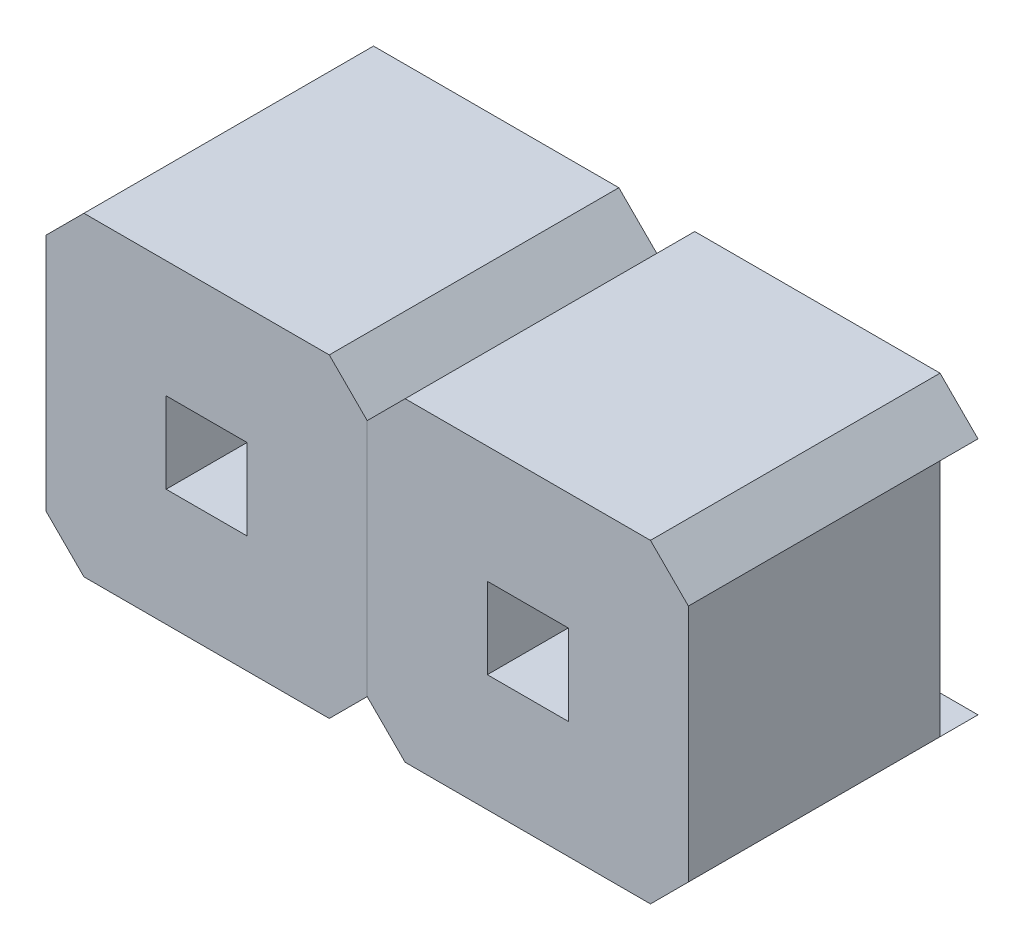
ISO-10303-21;
HEADER;
FILE_DESCRIPTION(('STEP AP214'),'2;1');
FILE_NAME('part.step','',(''),(''),'','','');
FILE_SCHEMA(('AUTOMOTIVE_DESIGN { 1 0 10303 214 1 1 1 1 }'));
ENDSEC;
DATA;
#1=APPLICATION_CONTEXT('core data for automotive mechanical design processes');
#2=APPLICATION_PROTOCOL_DEFINITION('international standard','automotive_design',2000,#1);
#3=PRODUCT_CONTEXT('',#1,'mechanical');
#4=PRODUCT('Part','Part','',(#3));
#5=PRODUCT_RELATED_PRODUCT_CATEGORY('part','',(#4));
#6=PRODUCT_DEFINITION_FORMATION('','',#4);
#7=PRODUCT_DEFINITION_CONTEXT('part definition',#1,'design');
#8=PRODUCT_DEFINITION('design','',#6,#7);
#9=PRODUCT_DEFINITION_SHAPE('','',#8);
#10=(LENGTH_UNIT() NAMED_UNIT(*) SI_UNIT(.MILLI.,.METRE.));
#11=(NAMED_UNIT(*) PLANE_ANGLE_UNIT() SI_UNIT($,.RADIAN.));
#12=(NAMED_UNIT(*) SI_UNIT($,.STERADIAN.) SOLID_ANGLE_UNIT());
#13=UNCERTAINTY_MEASURE_WITH_UNIT(LENGTH_MEASURE(1.E-05),#10,'distance_accuracy_value','');
#14=(GEOMETRIC_REPRESENTATION_CONTEXT(3) GLOBAL_UNCERTAINTY_ASSIGNED_CONTEXT((#13)) GLOBAL_UNIT_ASSIGNED_CONTEXT((#10,
#11,#12)) REPRESENTATION_CONTEXT('',''));
#15=CARTESIAN_POINT('',(0.,0.,0.));
#16=DIRECTION('',(0.,0.,1.));
#17=DIRECTION('',(1.,0.,0.));
#18=AXIS2_PLACEMENT_3D('',#15,#16,#17);
#19=CARTESIAN_POINT('',(0.32,-0.32,2.289999961853));
#20=DIRECTION('',(0.,1.,0.));
#21=DIRECTION('',(0.,0.,1.));
#22=AXIS2_PLACEMENT_3D('',#19,#20,#21);
#23=PLANE('',#22);
#24=DIRECTION('',(0.,0.,1.));
#25=VECTOR('',#24,1.);
#26=CARTESIAN_POINT('',(0.32,-0.32,2.289999961853));
#27=LINE('',#26,#25);
#28=CARTESIAN_POINT('',(0.32,-0.32,0.300000011921));
#29=VERTEX_POINT('',#28);
#30=CARTESIAN_POINT('',(0.32,-0.32,2.289999961853));
#31=VERTEX_POINT('',#30);
#32=EDGE_CURVE('P0_E118',#29,#31,#27,.T.);
#33=ORIENTED_EDGE('',*,*,#32,.F.);
#34=DIRECTION('',(1.,0.,0.));
#35=VECTOR('',#34,1.);
#36=CARTESIAN_POINT('',(0.32,-0.32,0.300000011921));
#37=LINE('',#36,#35);
#38=CARTESIAN_POINT('',(-0.32,-0.32,0.300000011921));
#39=VERTEX_POINT('',#38);
#40=EDGE_CURVE('P0_E123',#29,#39,#37,.F.);
#41=ORIENTED_EDGE('',*,*,#40,.T.);
#42=DIRECTION('',(0.,0.,-1.));
#43=VECTOR('',#42,1.);
#44=CARTESIAN_POINT('',(-0.32,-0.32,2.289999961853));
#45=LINE('',#44,#43);
#46=CARTESIAN_POINT('',(-0.32,-0.32,2.289999961853));
#47=VERTEX_POINT('',#46);
#48=EDGE_CURVE('P0_E121',#47,#39,#45,.T.);
#49=ORIENTED_EDGE('',*,*,#48,.F.);
#50=DIRECTION('',(1.,0.,0.));
#51=VECTOR('',#50,1.);
#52=CARTESIAN_POINT('',(0.32,-0.32,2.289999961853));
#53=LINE('',#52,#51);
#54=EDGE_CURVE('P0_E19',#47,#31,#53,.T.);
#55=ORIENTED_EDGE('',*,*,#54,.T.);
#56=EDGE_LOOP('',(#33,#41,#49,#55));
#57=FACE_BOUND('',#56,.T.);
#58=ADVANCED_FACE('P0_F16',(#57),#23,.T.);
#59=CARTESIAN_POINT('',(1.27,0.944999988079,0.));
#60=DIRECTION('',(0.,-1.,0.));
#61=DIRECTION('',(0.,0.,-1.));
#62=AXIS2_PLACEMENT_3D('',#59,#60,#61);
#63=PLANE('',#62);
#64=DIRECTION('',(0.,0.,1.));
#65=VECTOR('',#64,1.);
#66=CARTESIAN_POINT('',(1.2700000000005,0.9449999880795,0.));
#67=LINE('',#66,#65);
#68=CARTESIAN_POINT('',(1.27000000000006,0.944999988079063,0.300000011921));
#69=VERTEX_POINT('',#68);
#70=CARTESIAN_POINT('',(1.27000000000025,0.94499998807925,0.));
#71=VERTEX_POINT('',#70);
#72=EDGE_CURVE('P0_E147',#69,#71,#67,.F.);
#73=ORIENTED_EDGE('',*,*,#72,.F.);
#74=DIRECTION('',(-1.,0.,0.));
#75=VECTOR('',#74,1.);
#76=CARTESIAN_POINT('',(-1.27,0.944999988079,0.300000011921));
#77=LINE('',#76,#75);
#78=CARTESIAN_POINT('',(-1.27000000000013,0.944999988079125,0.300000011921));
#79=VERTEX_POINT('',#78);
#80=EDGE_CURVE('P0_E165',#79,#69,#77,.F.);
#81=ORIENTED_EDGE('',*,*,#80,.F.);
#82=DIRECTION('',(0.,0.,1.));
#83=VECTOR('',#82,1.);
#84=CARTESIAN_POINT('',(-1.2700000000005,0.9449999880795,0.));
#85=LINE('',#84,#83);
#86=CARTESIAN_POINT('',(-1.27000000000013,0.944999988079125,0.));
#87=VERTEX_POINT('',#86);
#88=EDGE_CURVE('P0_E170',#87,#79,#85,.T.);
#89=ORIENTED_EDGE('',*,*,#88,.F.);
#90=DIRECTION('',(1.,0.,0.));
#91=VECTOR('',#90,1.);
#92=CARTESIAN_POINT('',(-1.27,0.944999988079,0.));
#93=LINE('',#92,#91);
#94=EDGE_CURVE('P0_E176',#87,#71,#93,.T.);
#95=ORIENTED_EDGE('',*,*,#94,.T.);
#96=EDGE_LOOP('',(#73,#81,#89,#95));
#97=FACE_BOUND('',#96,.T.);
#98=ADVANCED_FACE('P0_F194',(#97),#63,.T.);
#99=CARTESIAN_POINT('',(-1.27,-0.944999988079,0.));
#100=DIRECTION('',(0.,1.,0.));
#101=DIRECTION('',(0.,0.,1.));
#102=AXIS2_PLACEMENT_3D('',#99,#100,#101);
#103=PLANE('',#102);
#104=DIRECTION('',(0.,0.,1.));
#105=VECTOR('',#104,1.);
#106=CARTESIAN_POINT('',(-1.2700000000005,-0.9449999880795,0.));
#107=LINE('',#106,#105);
#108=CARTESIAN_POINT('',(-1.27000000000006,-0.944999988079063,0.300000011921));
#109=VERTEX_POINT('',#108);
#110=CARTESIAN_POINT('',(-1.27000000000013,-0.944999988079125,0.));
#111=VERTEX_POINT('',#110);
#112=EDGE_CURVE('P0_E154',#109,#111,#107,.F.);
#113=ORIENTED_EDGE('',*,*,#112,.F.);
#114=DIRECTION('',(-1.,0.,0.));
#115=VECTOR('',#114,1.);
#116=CARTESIAN_POINT('',(-1.27,-0.944999988079,0.300000011921));
#117=LINE('',#116,#115);
#118=CARTESIAN_POINT('',(1.27000000000013,-0.944999988079125,0.300000011921));
#119=VERTEX_POINT('',#118);
#120=EDGE_CURVE('P0_E159',#119,#109,#117,.T.);
#121=ORIENTED_EDGE('',*,*,#120,.F.);
#122=DIRECTION('',(0.,0.,1.));
#123=VECTOR('',#122,1.);
#124=CARTESIAN_POINT('',(1.27,-0.944999988079,0.));
#125=LINE('',#124,#123);
#126=CARTESIAN_POINT('',(1.27000000000013,-0.944999988079125,0.));
#127=VERTEX_POINT('',#126);
#128=EDGE_CURVE('P0_E136',#119,#127,#125,.F.);
#129=ORIENTED_EDGE('',*,*,#128,.T.);
#130=DIRECTION('',(1.,0.,0.));
#131=VECTOR('',#130,1.);
#132=CARTESIAN_POINT('',(-1.27,-0.944999988079,0.));
#133=LINE('',#132,#131);
#134=EDGE_CURVE('P0_E230',#127,#111,#133,.F.);
#135=ORIENTED_EDGE('',*,*,#134,.T.);
#136=EDGE_LOOP('',(#113,#121,#129,#135));
#137=FACE_BOUND('',#136,.T.);
#138=ADVANCED_FACE('P0_F403',(#137),#103,.T.);
#139=CARTESIAN_POINT('',(0.32,0.32,2.289999961853));
#140=DIRECTION('',(-1.,0.,0.));
#141=DIRECTION('',(0.,0.,1.));
#142=AXIS2_PLACEMENT_3D('',#139,#140,#141);
#143=PLANE('',#142);
#144=DIRECTION('',(0.,0.,-1.));
#145=VECTOR('',#144,1.);
#146=CARTESIAN_POINT('',(0.32,0.32,2.289999961853));
#147=LINE('',#146,#145);
#148=CARTESIAN_POINT('',(0.32,0.32,0.300000011921));
#149=VERTEX_POINT('',#148);
#150=CARTESIAN_POINT('',(0.32,0.32,2.289999961853));
#151=VERTEX_POINT('',#150);
#152=EDGE_CURVE('P0_E222',#149,#151,#147,.F.);
#153=ORIENTED_EDGE('',*,*,#152,.F.);
#154=DIRECTION('',(0.,1.,0.));
#155=VECTOR('',#154,1.);
#156=CARTESIAN_POINT('',(0.32,-0.944999988079,0.300000011921));
#157=LINE('',#156,#155);
#158=EDGE_CURVE('P0_E135',#29,#149,#157,.T.);
#159=ORIENTED_EDGE('',*,*,#158,.F.);
#160=ORIENTED_EDGE('',*,*,#32,.T.);
#161=DIRECTION('',(0.,1.,0.));
#162=VECTOR('',#161,1.);
#163=CARTESIAN_POINT('',(0.32,0.32,2.289999961853));
#164=LINE('',#163,#162);
#165=EDGE_CURVE('P0_E125',#31,#151,#164,.T.);
#166=ORIENTED_EDGE('',*,*,#165,.T.);
#167=EDGE_LOOP('',(#153,#159,#160,#166));
#168=FACE_BOUND('',#167,.T.);
#169=ADVANCED_FACE('P0_F133',(#168),#143,.T.);
#170=CARTESIAN_POINT('',(-0.32,-0.32,2.289999961853));
#171=DIRECTION('',(1.,0.,0.));
#172=DIRECTION('',(0.,0.,-1.));
#173=AXIS2_PLACEMENT_3D('',#170,#171,#172);
#174=PLANE('',#173);
#175=ORIENTED_EDGE('',*,*,#48,.T.);
#176=DIRECTION('',(0.,1.,0.));
#177=VECTOR('',#176,1.);
#178=CARTESIAN_POINT('',(-0.32,-0.944999988079,0.300000011921));
#179=LINE('',#178,#177);
#180=CARTESIAN_POINT('',(-0.32,0.32,0.300000011921));
#181=VERTEX_POINT('',#180);
#182=EDGE_CURVE('P0_E145',#181,#39,#179,.F.);
#183=ORIENTED_EDGE('',*,*,#182,.F.);
#184=DIRECTION('',(0.,0.,-1.));
#185=VECTOR('',#184,1.);
#186=CARTESIAN_POINT('',(-0.32,0.32,2.289999961853));
#187=LINE('',#186,#185);
#188=CARTESIAN_POINT('',(-0.32,0.32,2.289999961853));
#189=VERTEX_POINT('',#188);
#190=EDGE_CURVE('P0_E220',#189,#181,#187,.T.);
#191=ORIENTED_EDGE('',*,*,#190,.F.);
#192=DIRECTION('',(0.,1.,0.));
#193=VECTOR('',#192,1.);
#194=CARTESIAN_POINT('',(-0.32,-0.32,2.289999961853));
#195=LINE('',#194,#193);
#196=EDGE_CURVE('P0_E131',#189,#47,#195,.F.);
#197=ORIENTED_EDGE('',*,*,#196,.T.);
#198=EDGE_LOOP('',(#175,#183,#191,#197));
#199=FACE_BOUND('',#198,.T.);
#200=ADVANCED_FACE('P0_F143',(#199),#174,.T.);
#201=CARTESIAN_POINT('',(1.11999999404,1.09499999404,0.));
#202=DIRECTION('',(0.707106781186548,0.707106781186548,0.));
#203=DIRECTION('',(-0.707106781186548,0.707106781186548,0.));
#204=AXIS2_PLACEMENT_3D('',#201,#202,#203);
#205=PLANE('',#204);
#206=DIRECTION('',(0.,0.,1.));
#207=VECTOR('',#206,1.);
#208=CARTESIAN_POINT('',(0.969999988079,1.245,0.));
#209=LINE('',#208,#207);
#210=CARTESIAN_POINT('',(0.96999998807925,1.24500000000025,2.289999961853));
#211=VERTEX_POINT('',#210);
#212=CARTESIAN_POINT('',(0.96999998807925,1.24500000000025,0.));
#213=VERTEX_POINT('',#212);
#214=EDGE_CURVE('P0_E204',#211,#213,#209,.F.);
#215=ORIENTED_EDGE('',*,*,#214,.F.);
#216=DIRECTION('',(-0.707106781186548,0.707106781186548,0.));
#217=VECTOR('',#216,1.);
#218=CARTESIAN_POINT('',(1.11999999404,1.09499999404,2.289999961853));
#219=LINE('',#218,#217);
#220=CARTESIAN_POINT('',(1.27000000000025,0.94499998807925,2.289999961853));
#221=VERTEX_POINT('',#220);
#222=EDGE_CURVE('P0_E181',#211,#221,#219,.F.);
#223=ORIENTED_EDGE('',*,*,#222,.T.);
#224=DIRECTION('',(0.,0.,-1.));
#225=VECTOR('',#224,1.);
#226=CARTESIAN_POINT('',(1.27,0.944999988079,0.));
#227=LINE('',#226,#225);
#228=EDGE_CURVE('P0_E190',#69,#221,#227,.F.);
#229=ORIENTED_EDGE('',*,*,#228,.F.);
#230=ORIENTED_EDGE('',*,*,#72,.T.);
#231=DIRECTION('',(-0.707106781186547,0.707106781186548,0.));
#232=VECTOR('',#231,1.);
#233=CARTESIAN_POINT('',(1.27,0.944999988079,0.));
#234=LINE('',#233,#232);
#235=EDGE_CURVE('P0_E179',#71,#213,#234,.T.);
#236=ORIENTED_EDGE('',*,*,#235,.T.);
#237=EDGE_LOOP('',(#215,#223,#229,#230,#236));
#238=FACE_BOUND('',#237,.T.);
#239=ADVANCED_FACE('P0_F186',(#238),#205,.T.);
#240=CARTESIAN_POINT('',(-1.27,1.245,0.));
#241=DIRECTION('',(0.,0.,1.));
#242=DIRECTION('',(1.,0.,0.));
#243=AXIS2_PLACEMENT_3D('',#240,#241,#242);
#244=PLANE('',#243);
#245=DIRECTION('',(-0.707106781186548,-0.707106781186548,0.));
#246=VECTOR('',#245,1.);
#247=CARTESIAN_POINT('',(-1.11999999404,1.09499999404,0.));
#248=LINE('',#247,#246);
#249=CARTESIAN_POINT('',(-0.969999988079125,1.24500000000013,0.));
#250=VERTEX_POINT('',#249);
#251=EDGE_CURVE('P0_E173',#250,#87,#248,.T.);
#252=ORIENTED_EDGE('',*,*,#251,.F.);
#253=DIRECTION('',(1.,0.,0.));
#254=VECTOR('',#253,1.);
#255=CARTESIAN_POINT('',(-1.27,1.245,0.));
#256=LINE('',#255,#254);
#257=EDGE_CURVE('P0_E198',#213,#250,#256,.F.);
#258=ORIENTED_EDGE('',*,*,#257,.F.);
#259=ORIENTED_EDGE('',*,*,#235,.F.);
#260=ORIENTED_EDGE('',*,*,#94,.F.);
#261=EDGE_LOOP('',(#252,#258,#259,#260));
#262=FACE_BOUND('',#261,.T.);
#263=ADVANCED_FACE('P0_F196',(#262),#244,.F.);
#264=CARTESIAN_POINT('',(-1.11999999404,1.09499999404,0.));
#265=DIRECTION('',(-0.707106781186548,0.707106781186548,0.));
#266=DIRECTION('',(-0.707106781186548,-0.707106781186548,0.));
#267=AXIS2_PLACEMENT_3D('',#264,#265,#266);
#268=PLANE('',#267);
#269=DIRECTION('',(0.,0.,1.));
#270=VECTOR('',#269,1.);
#271=CARTESIAN_POINT('',(-1.27,0.944999988079,0.));
#272=LINE('',#271,#270);
#273=CARTESIAN_POINT('',(-1.27000000000025,0.94499998807925,2.289999961853));
#274=VERTEX_POINT('',#273);
#275=EDGE_CURVE('P0_E265',#274,#79,#272,.F.);
#276=ORIENTED_EDGE('',*,*,#275,.F.);
#277=DIRECTION('',(-0.707106781186548,-0.707106781186548,0.));
#278=VECTOR('',#277,1.);
#279=CARTESIAN_POINT('',(-1.11999999404,1.09499999404,2.289999961853));
#280=LINE('',#279,#278);
#281=CARTESIAN_POINT('',(-0.96999998807925,1.24500000000025,2.289999961853));
#282=VERTEX_POINT('',#281);
#283=EDGE_CURVE('P0_E168',#274,#282,#280,.F.);
#284=ORIENTED_EDGE('',*,*,#283,.T.);
#285=DIRECTION('',(0.,0.,1.));
#286=VECTOR('',#285,1.);
#287=CARTESIAN_POINT('',(-0.969999988079,1.245,0.));
#288=LINE('',#287,#286);
#289=EDGE_CURVE('P0_E203',#250,#282,#288,.T.);
#290=ORIENTED_EDGE('',*,*,#289,.F.);
#291=ORIENTED_EDGE('',*,*,#251,.T.);
#292=ORIENTED_EDGE('',*,*,#88,.T.);
#293=EDGE_LOOP('',(#276,#284,#290,#291,#292));
#294=FACE_BOUND('',#293,.T.);
#295=ADVANCED_FACE('P0_F272',(#294),#268,.T.);
#296=CARTESIAN_POINT('',(-1.27,-0.944999988079,0.300000011921));
#297=DIRECTION('',(0.,0.,-1.));
#298=DIRECTION('',(-1.,0.,0.));
#299=AXIS2_PLACEMENT_3D('',#296,#297,#298);
#300=PLANE('',#299);
#301=ORIENTED_EDGE('',*,*,#182,.T.);
#302=ORIENTED_EDGE('',*,*,#40,.F.);
#303=ORIENTED_EDGE('',*,*,#158,.T.);
#304=DIRECTION('',(1.,0.,0.));
#305=VECTOR('',#304,1.);
#306=CARTESIAN_POINT('',(-0.32,0.32,0.300000011921));
#307=LINE('',#306,#305);
#308=EDGE_CURVE('P0_E152',#181,#149,#307,.T.);
#309=ORIENTED_EDGE('',*,*,#308,.F.);
#310=EDGE_LOOP('',(#301,#302,#303,#309));
#311=FACE_BOUND('',#310,.T.);
#312=ORIENTED_EDGE('',*,*,#120,.T.);
#313=DIRECTION('',(0.,1.,0.));
#314=VECTOR('',#313,1.);
#315=CARTESIAN_POINT('',(-1.27,-1.245,0.300000011921));
#316=LINE('',#315,#314);
#317=EDGE_CURVE('P0_E248',#79,#109,#316,.F.);
#318=ORIENTED_EDGE('',*,*,#317,.F.);
#319=ORIENTED_EDGE('',*,*,#80,.T.);
#320=DIRECTION('',(0.,1.,0.));
#321=VECTOR('',#320,1.);
#322=CARTESIAN_POINT('',(1.27,1.245,0.300000011921));
#323=LINE('',#322,#321);
#324=EDGE_CURVE('P0_E211',#119,#69,#323,.T.);
#325=ORIENTED_EDGE('',*,*,#324,.F.);
#326=EDGE_LOOP('',(#312,#318,#319,#325));
#327=FACE_BOUND('',#326,.T.);
#328=ADVANCED_FACE('P0_F149',(#311,#327),#300,.T.);
#329=CARTESIAN_POINT('',(-1.11999999404,-1.09499999404,0.));
#330=DIRECTION('',(-0.707106781186548,-0.707106781186548,0.));
#331=DIRECTION('',(0.707106781186548,-0.707106781186548,0.));
#332=AXIS2_PLACEMENT_3D('',#329,#330,#331);
#333=PLANE('',#332);
#334=DIRECTION('',(0.707106781186548,-0.707106781186548,0.));
#335=VECTOR('',#334,1.);
#336=CARTESIAN_POINT('',(-1.11999999404,-1.09499999404,2.289999961853));
#337=LINE('',#336,#335);
#338=CARTESIAN_POINT('',(-0.96999998807925,-1.24500000000025,2.289999961853));
#339=VERTEX_POINT('',#338);
#340=CARTESIAN_POINT('',(-1.27000000000025,-0.94499998807925,2.289999961853));
#341=VERTEX_POINT('',#340);
#342=EDGE_CURVE('P0_E157',#339,#341,#337,.F.);
#343=ORIENTED_EDGE('',*,*,#342,.T.);
#344=DIRECTION('',(0.,0.,1.));
#345=VECTOR('',#344,1.);
#346=CARTESIAN_POINT('',(-1.27,-0.944999988079,0.));
#347=LINE('',#346,#345);
#348=EDGE_CURVE('P0_E236',#109,#341,#347,.T.);
#349=ORIENTED_EDGE('',*,*,#348,.F.);
#350=ORIENTED_EDGE('',*,*,#112,.T.);
#351=DIRECTION('',(0.707106781186547,-0.707106781186548,0.));
#352=VECTOR('',#351,1.);
#353=CARTESIAN_POINT('',(-1.27,-0.944999988079,0.));
#354=LINE('',#353,#352);
#355=CARTESIAN_POINT('',(-0.96999998807925,-1.24500000000025,0.));
#356=VERTEX_POINT('',#355);
#357=EDGE_CURVE('P0_E228',#111,#356,#354,.T.);
#358=ORIENTED_EDGE('',*,*,#357,.T.);
#359=DIRECTION('',(0.,0.,-1.));
#360=VECTOR('',#359,1.);
#361=CARTESIAN_POINT('',(-0.969999988079,-1.245,0.));
#362=LINE('',#361,#360);
#363=EDGE_CURVE('P0_E239',#339,#356,#362,.T.);
#364=ORIENTED_EDGE('',*,*,#363,.F.);
#365=EDGE_LOOP('',(#343,#349,#350,#358,#364));
#366=FACE_BOUND('',#365,.T.);
#367=ADVANCED_FACE('P0_F235',(#366),#333,.T.);
#368=CARTESIAN_POINT('',(-1.27,1.245,0.));
#369=DIRECTION('',(0.,0.,1.));
#370=DIRECTION('',(1.,0.,0.));
#371=AXIS2_PLACEMENT_3D('',#368,#369,#370);
#372=PLANE('',#371);
#373=ORIENTED_EDGE('',*,*,#357,.F.);
#374=ORIENTED_EDGE('',*,*,#134,.F.);
#375=DIRECTION('',(0.707106781186548,0.707106781186548,0.));
#376=VECTOR('',#375,1.);
#377=CARTESIAN_POINT('',(1.11999999404,-1.09499999404,0.));
#378=LINE('',#377,#376);
#379=CARTESIAN_POINT('',(0.969999988079125,-1.24500000000013,0.));
#380=VERTEX_POINT('',#379);
#381=EDGE_CURVE('P0_E224',#380,#127,#378,.T.);
#382=ORIENTED_EDGE('',*,*,#381,.F.);
#383=DIRECTION('',(1.,0.,0.));
#384=VECTOR('',#383,1.);
#385=CARTESIAN_POINT('',(1.27,-1.245,0.));
#386=LINE('',#385,#384);
#387=EDGE_CURVE('P0_E260',#356,#380,#386,.T.);
#388=ORIENTED_EDGE('',*,*,#387,.F.);
#389=EDGE_LOOP('',(#373,#374,#382,#388));
#390=FACE_BOUND('',#389,.T.);
#391=ADVANCED_FACE('P0_F304',(#390),#372,.F.);
#392=CARTESIAN_POINT('',(1.11999999404,-1.09499999404,0.));
#393=DIRECTION('',(0.707106781186548,-0.707106781186548,0.));
#394=DIRECTION('',(0.707106781186548,0.707106781186548,0.));
#395=AXIS2_PLACEMENT_3D('',#392,#393,#394);
#396=PLANE('',#395);
#397=ORIENTED_EDGE('',*,*,#128,.F.);
#398=DIRECTION('',(0.,0.,-1.));
#399=VECTOR('',#398,1.);
#400=CARTESIAN_POINT('',(1.27,-0.944999988079,0.));
#401=LINE('',#400,#399);
#402=CARTESIAN_POINT('',(1.27000000000025,-0.94499998807925,2.289999961853));
#403=VERTEX_POINT('',#402);
#404=EDGE_CURVE('P0_E216',#403,#119,#401,.T.);
#405=ORIENTED_EDGE('',*,*,#404,.F.);
#406=DIRECTION('',(0.707106781186548,0.707106781186548,0.));
#407=VECTOR('',#406,1.);
#408=CARTESIAN_POINT('',(1.11999999404,-1.09499999404,2.289999961853));
#409=LINE('',#408,#407);
#410=CARTESIAN_POINT('',(0.96999998807925,-1.24500000000025,2.289999961853));
#411=VERTEX_POINT('',#410);
#412=EDGE_CURVE('P0_E34',#403,#411,#409,.F.);
#413=ORIENTED_EDGE('',*,*,#412,.T.);
#414=DIRECTION('',(0.,0.,-1.));
#415=VECTOR('',#414,1.);
#416=CARTESIAN_POINT('',(0.969999988079,-1.245,0.));
#417=LINE('',#416,#415);
#418=EDGE_CURVE('P0_E258',#380,#411,#417,.F.);
#419=ORIENTED_EDGE('',*,*,#418,.F.);
#420=ORIENTED_EDGE('',*,*,#381,.T.);
#421=EDGE_LOOP('',(#397,#405,#413,#419,#420));
#422=FACE_BOUND('',#421,.T.);
#423=ADVANCED_FACE('P0_F300',(#422),#396,.T.);
#424=CARTESIAN_POINT('',(-0.32,0.32,2.289999961853));
#425=DIRECTION('',(0.,-1.,0.));
#426=DIRECTION('',(0.,0.,-1.));
#427=AXIS2_PLACEMENT_3D('',#424,#425,#426);
#428=PLANE('',#427);
#429=ORIENTED_EDGE('',*,*,#190,.T.);
#430=ORIENTED_EDGE('',*,*,#308,.T.);
#431=ORIENTED_EDGE('',*,*,#152,.T.);
#432=DIRECTION('',(1.,0.,0.));
#433=VECTOR('',#432,1.);
#434=CARTESIAN_POINT('',(-1.27,0.32,2.289999961853));
#435=LINE('',#434,#433);
#436=EDGE_CURVE('P0_E128',#189,#151,#435,.T.);
#437=ORIENTED_EDGE('',*,*,#436,.F.);
#438=EDGE_LOOP('',(#429,#430,#431,#437));
#439=FACE_BOUND('',#438,.T.);
#440=ADVANCED_FACE('P0_F297',(#439),#428,.T.);
#441=CARTESIAN_POINT('',(1.27,1.245,0.));
#442=DIRECTION('',(1.,0.,0.));
#443=DIRECTION('',(0.,0.,-1.));
#444=AXIS2_PLACEMENT_3D('',#441,#442,#443);
#445=PLANE('',#444);
#446=ORIENTED_EDGE('',*,*,#324,.T.);
#447=ORIENTED_EDGE('',*,*,#228,.T.);
#448=DIRECTION('',(0.,1.,0.));
#449=VECTOR('',#448,1.);
#450=CARTESIAN_POINT('',(1.27,1.245,2.289999961853));
#451=LINE('',#450,#449);
#452=EDGE_CURVE('P0_E252',#403,#221,#451,.T.);
#453=ORIENTED_EDGE('',*,*,#452,.F.);
#454=ORIENTED_EDGE('',*,*,#404,.T.);
#455=EDGE_LOOP('',(#446,#447,#453,#454));
#456=FACE_BOUND('',#455,.T.);
#457=ADVANCED_FACE('P0_F269',(#456),#445,.T.);
#458=CARTESIAN_POINT('',(-1.27,1.245,0.));
#459=DIRECTION('',(0.,1.,0.));
#460=DIRECTION('',(0.,0.,1.));
#461=AXIS2_PLACEMENT_3D('',#458,#459,#460);
#462=PLANE('',#461);
#463=ORIENTED_EDGE('',*,*,#257,.T.);
#464=ORIENTED_EDGE('',*,*,#289,.T.);
#465=DIRECTION('',(1.,0.,0.));
#466=VECTOR('',#465,1.);
#467=CARTESIAN_POINT('',(-1.27,1.245,2.289999961853));
#468=LINE('',#467,#466);
#469=EDGE_CURVE('P0_E209',#211,#282,#468,.F.);
#470=ORIENTED_EDGE('',*,*,#469,.F.);
#471=ORIENTED_EDGE('',*,*,#214,.T.);
#472=EDGE_LOOP('',(#463,#464,#470,#471));
#473=FACE_BOUND('',#472,.T.);
#474=ADVANCED_FACE('P0_F207',(#473),#462,.T.);
#475=CARTESIAN_POINT('',(-1.27,-1.245,0.));
#476=DIRECTION('',(-1.,0.,0.));
#477=DIRECTION('',(0.,0.,1.));
#478=AXIS2_PLACEMENT_3D('',#475,#476,#477);
#479=PLANE('',#478);
#480=ORIENTED_EDGE('',*,*,#317,.T.);
#481=ORIENTED_EDGE('',*,*,#348,.T.);
#482=DIRECTION('',(0.,1.,0.));
#483=VECTOR('',#482,1.);
#484=CARTESIAN_POINT('',(-1.27,1.245,2.289999961853));
#485=LINE('',#484,#483);
#486=EDGE_CURVE('P0_E25',#274,#341,#485,.F.);
#487=ORIENTED_EDGE('',*,*,#486,.F.);
#488=ORIENTED_EDGE('',*,*,#275,.T.);
#489=EDGE_LOOP('',(#480,#481,#487,#488));
#490=FACE_BOUND('',#489,.T.);
#491=ADVANCED_FACE('P0_F245',(#490),#479,.T.);
#492=CARTESIAN_POINT('',(1.27,-1.245,0.));
#493=DIRECTION('',(0.,-1.,0.));
#494=DIRECTION('',(0.,0.,-1.));
#495=AXIS2_PLACEMENT_3D('',#492,#493,#494);
#496=PLANE('',#495);
#497=ORIENTED_EDGE('',*,*,#387,.T.);
#498=ORIENTED_EDGE('',*,*,#418,.T.);
#499=DIRECTION('',(1.,0.,0.));
#500=VECTOR('',#499,1.);
#501=CARTESIAN_POINT('',(-1.27,-1.245,2.289999961853));
#502=LINE('',#501,#500);
#503=EDGE_CURVE('P0_E11',#339,#411,#502,.T.);
#504=ORIENTED_EDGE('',*,*,#503,.F.);
#505=ORIENTED_EDGE('',*,*,#363,.T.);
#506=EDGE_LOOP('',(#497,#498,#504,#505));
#507=FACE_BOUND('',#506,.T.);
#508=ADVANCED_FACE('P0_F283',(#507),#496,.T.);
#509=CARTESIAN_POINT('',(-1.27,1.245,2.289999961853));
#510=DIRECTION('',(0.,0.,1.));
#511=DIRECTION('',(1.,0.,0.));
#512=AXIS2_PLACEMENT_3D('',#509,#510,#511);
#513=PLANE('',#512);
#514=ORIENTED_EDGE('',*,*,#503,.T.);
#515=ORIENTED_EDGE('',*,*,#412,.F.);
#516=ORIENTED_EDGE('',*,*,#452,.T.);
#517=ORIENTED_EDGE('',*,*,#222,.F.);
#518=ORIENTED_EDGE('',*,*,#469,.T.);
#519=ORIENTED_EDGE('',*,*,#283,.F.);
#520=ORIENTED_EDGE('',*,*,#486,.T.);
#521=ORIENTED_EDGE('',*,*,#342,.F.);
#522=EDGE_LOOP('',(#514,#515,#516,#517,#518,#519,#520,#521));
#523=FACE_BOUND('',#522,.T.);
#524=ORIENTED_EDGE('',*,*,#196,.F.);
#525=ORIENTED_EDGE('',*,*,#436,.T.);
#526=ORIENTED_EDGE('',*,*,#165,.F.);
#527=ORIENTED_EDGE('',*,*,#54,.F.);
#528=EDGE_LOOP('',(#524,#525,#526,#527));
#529=FACE_BOUND('',#528,.T.);
#530=ADVANCED_FACE('P0_F126',(#523,#529),#513,.T.);
#531=CLOSED_SHELL('',(#58,#98,#138,#169,#200,#239,#263,#295,#328,#367,#391,#423,#440,#457,#474,
#491,#508,#530));
#532=MANIFOLD_SOLID_BREP('P0_B1',#531);
#533=CARTESIAN_POINT('',(2.859999961853,-0.32,2.289999961853));
#534=DIRECTION('',(0.,1.,0.));
#535=DIRECTION('',(0.,0.,1.));
#536=AXIS2_PLACEMENT_3D('',#533,#534,#535);
#537=PLANE('',#536);
#538=DIRECTION('',(0.,0.,1.));
#539=VECTOR('',#538,1.);
#540=CARTESIAN_POINT('',(2.859999961853,-0.32,2.289999961853));
#541=LINE('',#540,#539);
#542=CARTESIAN_POINT('',(2.859999961853,-0.32,0.300000011921));
#543=VERTEX_POINT('',#542);
#544=CARTESIAN_POINT('',(2.859999961853,-0.32,2.289999961853));
#545=VERTEX_POINT('',#544);
#546=EDGE_CURVE('P1_E118',#543,#545,#541,.T.);
#547=ORIENTED_EDGE('',*,*,#546,.F.);
#548=DIRECTION('',(1.,0.,0.));
#549=VECTOR('',#548,1.);
#550=CARTESIAN_POINT('',(2.859999961853,-0.32,0.300000011921));
#551=LINE('',#550,#549);
#552=CARTESIAN_POINT('',(2.219999961853,-0.32,0.300000011921));
#553=VERTEX_POINT('',#552);
#554=EDGE_CURVE('P1_E123',#543,#553,#551,.F.);
#555=ORIENTED_EDGE('',*,*,#554,.T.);
#556=DIRECTION('',(0.,0.,-1.));
#557=VECTOR('',#556,1.);
#558=CARTESIAN_POINT('',(2.219999961853,-0.32,2.289999961853));
#559=LINE('',#558,#557);
#560=CARTESIAN_POINT('',(2.219999961853,-0.32,2.289999961853));
#561=VERTEX_POINT('',#560);
#562=EDGE_CURVE('P1_E121',#561,#553,#559,.T.);
#563=ORIENTED_EDGE('',*,*,#562,.F.);
#564=DIRECTION('',(1.,0.,0.));
#565=VECTOR('',#564,1.);
#566=CARTESIAN_POINT('',(2.859999961853,-0.32,2.289999961853));
#567=LINE('',#566,#565);
#568=EDGE_CURVE('P1_E19',#561,#545,#567,.T.);
#569=ORIENTED_EDGE('',*,*,#568,.T.);
#570=EDGE_LOOP('',(#547,#555,#563,#569));
#571=FACE_BOUND('',#570,.T.);
#572=ADVANCED_FACE('P1_F16',(#571),#537,.T.);
#573=CARTESIAN_POINT('',(3.809999961853,0.944999988079,0.));
#574=DIRECTION('',(0.,-1.,0.));
#575=DIRECTION('',(0.,0.,-1.));
#576=AXIS2_PLACEMENT_3D('',#573,#574,#575);
#577=PLANE('',#576);
#578=DIRECTION('',(0.,0.,1.));
#579=VECTOR('',#578,1.);
#580=CARTESIAN_POINT('',(3.8099999618535,0.9449999880795,0.));
#581=LINE('',#580,#579);
#582=CARTESIAN_POINT('',(3.80999996185306,0.944999988079063,0.300000011921));
#583=VERTEX_POINT('',#582);
#584=CARTESIAN_POINT('',(3.80999996185325,0.94499998807925,0.));
#585=VERTEX_POINT('',#584);
#586=EDGE_CURVE('P1_E147',#583,#585,#581,.F.);
#587=ORIENTED_EDGE('',*,*,#586,.F.);
#588=DIRECTION('',(-1.,0.,0.));
#589=VECTOR('',#588,1.);
#590=CARTESIAN_POINT('',(1.269999961853,0.944999988079,0.300000011921));
#591=LINE('',#590,#589);
#592=CARTESIAN_POINT('',(1.26999996185288,0.944999988079125,0.300000011921));
#593=VERTEX_POINT('',#592);
#594=EDGE_CURVE('P1_E165',#593,#583,#591,.F.);
#595=ORIENTED_EDGE('',*,*,#594,.F.);
#596=DIRECTION('',(0.,0.,1.));
#597=VECTOR('',#596,1.);
#598=CARTESIAN_POINT('',(1.2699999618525,0.9449999880795,0.));
#599=LINE('',#598,#597);
#600=CARTESIAN_POINT('',(1.26999996185288,0.944999988079125,0.));
#601=VERTEX_POINT('',#600);
#602=EDGE_CURVE('P1_E170',#601,#593,#599,.T.);
#603=ORIENTED_EDGE('',*,*,#602,.F.);
#604=DIRECTION('',(1.,0.,0.));
#605=VECTOR('',#604,1.);
#606=CARTESIAN_POINT('',(1.269999961853,0.944999988079,0.));
#607=LINE('',#606,#605);
#608=EDGE_CURVE('P1_E176',#601,#585,#607,.T.);
#609=ORIENTED_EDGE('',*,*,#608,.T.);
#610=EDGE_LOOP('',(#587,#595,#603,#609));
#611=FACE_BOUND('',#610,.T.);
#612=ADVANCED_FACE('P1_F194',(#611),#577,.T.);
#613=CARTESIAN_POINT('',(1.269999961853,-0.944999988079,0.));
#614=DIRECTION('',(0.,1.,0.));
#615=DIRECTION('',(0.,0.,1.));
#616=AXIS2_PLACEMENT_3D('',#613,#614,#615);
#617=PLANE('',#616);
#618=DIRECTION('',(0.,0.,1.));
#619=VECTOR('',#618,1.);
#620=CARTESIAN_POINT('',(1.2699999618525,-0.9449999880795,0.));
#621=LINE('',#620,#619);
#622=CARTESIAN_POINT('',(1.26999996185294,-0.944999988079063,0.300000011921));
#623=VERTEX_POINT('',#622);
#624=CARTESIAN_POINT('',(1.26999996185288,-0.944999988079125,0.));
#625=VERTEX_POINT('',#624);
#626=EDGE_CURVE('P1_E154',#623,#625,#621,.F.);
#627=ORIENTED_EDGE('',*,*,#626,.F.);
#628=DIRECTION('',(-1.,0.,0.));
#629=VECTOR('',#628,1.);
#630=CARTESIAN_POINT('',(1.269999961853,-0.944999988079,0.300000011921));
#631=LINE('',#630,#629);
#632=CARTESIAN_POINT('',(3.80999996185312,-0.944999988079125,0.300000011921));
#633=VERTEX_POINT('',#632);
#634=EDGE_CURVE('P1_E159',#633,#623,#631,.T.);
#635=ORIENTED_EDGE('',*,*,#634,.F.);
#636=DIRECTION('',(0.,0.,1.));
#637=VECTOR('',#636,1.);
#638=CARTESIAN_POINT('',(3.809999961853,-0.944999988079,0.));
#639=LINE('',#638,#637);
#640=CARTESIAN_POINT('',(3.80999996185312,-0.944999988079125,0.));
#641=VERTEX_POINT('',#640);
#642=EDGE_CURVE('P1_E136',#633,#641,#639,.F.);
#643=ORIENTED_EDGE('',*,*,#642,.T.);
#644=DIRECTION('',(1.,0.,0.));
#645=VECTOR('',#644,1.);
#646=CARTESIAN_POINT('',(1.269999961853,-0.944999988079,0.));
#647=LINE('',#646,#645);
#648=EDGE_CURVE('P1_E230',#641,#625,#647,.F.);
#649=ORIENTED_EDGE('',*,*,#648,.T.);
#650=EDGE_LOOP('',(#627,#635,#643,#649));
#651=FACE_BOUND('',#650,.T.);
#652=ADVANCED_FACE('P1_F403',(#651),#617,.T.);
#653=CARTESIAN_POINT('',(2.859999961853,0.32,2.289999961853));
#654=DIRECTION('',(-1.,0.,0.));
#655=DIRECTION('',(0.,0.,1.));
#656=AXIS2_PLACEMENT_3D('',#653,#654,#655);
#657=PLANE('',#656);
#658=DIRECTION('',(0.,0.,-1.));
#659=VECTOR('',#658,1.);
#660=CARTESIAN_POINT('',(2.859999961853,0.32,2.289999961853));
#661=LINE('',#660,#659);
#662=CARTESIAN_POINT('',(2.859999961853,0.32,0.300000011921));
#663=VERTEX_POINT('',#662);
#664=CARTESIAN_POINT('',(2.859999961853,0.32,2.289999961853));
#665=VERTEX_POINT('',#664);
#666=EDGE_CURVE('P1_E222',#663,#665,#661,.F.);
#667=ORIENTED_EDGE('',*,*,#666,.F.);
#668=DIRECTION('',(0.,1.,0.));
#669=VECTOR('',#668,1.);
#670=CARTESIAN_POINT('',(2.859999961853,-0.944999988079,0.300000011921));
#671=LINE('',#670,#669);
#672=EDGE_CURVE('P1_E135',#543,#663,#671,.T.);
#673=ORIENTED_EDGE('',*,*,#672,.F.);
#674=ORIENTED_EDGE('',*,*,#546,.T.);
#675=DIRECTION('',(0.,1.,0.));
#676=VECTOR('',#675,1.);
#677=CARTESIAN_POINT('',(2.859999961853,0.32,2.289999961853));
#678=LINE('',#677,#676);
#679=EDGE_CURVE('P1_E125',#545,#665,#678,.T.);
#680=ORIENTED_EDGE('',*,*,#679,.T.);
#681=EDGE_LOOP('',(#667,#673,#674,#680));
#682=FACE_BOUND('',#681,.T.);
#683=ADVANCED_FACE('P1_F133',(#682),#657,.T.);
#684=CARTESIAN_POINT('',(2.219999961853,-0.32,2.289999961853));
#685=DIRECTION('',(1.,0.,0.));
#686=DIRECTION('',(0.,0.,-1.));
#687=AXIS2_PLACEMENT_3D('',#684,#685,#686);
#688=PLANE('',#687);
#689=ORIENTED_EDGE('',*,*,#562,.T.);
#690=DIRECTION('',(0.,1.,0.));
#691=VECTOR('',#690,1.);
#692=CARTESIAN_POINT('',(2.219999961853,-0.944999988079,0.300000011921));
#693=LINE('',#692,#691);
#694=CARTESIAN_POINT('',(2.219999961853,0.32,0.300000011921));
#695=VERTEX_POINT('',#694);
#696=EDGE_CURVE('P1_E145',#695,#553,#693,.F.);
#697=ORIENTED_EDGE('',*,*,#696,.F.);
#698=DIRECTION('',(0.,0.,-1.));
#699=VECTOR('',#698,1.);
#700=CARTESIAN_POINT('',(2.219999961853,0.32,2.289999961853));
#701=LINE('',#700,#699);
#702=CARTESIAN_POINT('',(2.219999961853,0.32,2.289999961853));
#703=VERTEX_POINT('',#702);
#704=EDGE_CURVE('P1_E220',#703,#695,#701,.T.);
#705=ORIENTED_EDGE('',*,*,#704,.F.);
#706=DIRECTION('',(0.,1.,0.));
#707=VECTOR('',#706,1.);
#708=CARTESIAN_POINT('',(2.219999961853,-0.32,2.289999961853));
#709=LINE('',#708,#707);
#710=EDGE_CURVE('P1_E131',#703,#561,#709,.F.);
#711=ORIENTED_EDGE('',*,*,#710,.T.);
#712=EDGE_LOOP('',(#689,#697,#705,#711));
#713=FACE_BOUND('',#712,.T.);
#714=ADVANCED_FACE('P1_F143',(#713),#688,.T.);
#715=CARTESIAN_POINT('',(3.659999955893,1.09499999404,0.));
#716=DIRECTION('',(0.707106781186548,0.707106781186548,0.));
#717=DIRECTION('',(-0.707106781186548,0.707106781186548,0.));
#718=AXIS2_PLACEMENT_3D('',#715,#716,#717);
#719=PLANE('',#718);
#720=DIRECTION('',(0.,0.,1.));
#721=VECTOR('',#720,1.);
#722=CARTESIAN_POINT('',(3.509999949932,1.245,0.));
#723=LINE('',#722,#721);
#724=CARTESIAN_POINT('',(3.50999994993225,1.24500000000025,2.289999961853));
#725=VERTEX_POINT('',#724);
#726=CARTESIAN_POINT('',(3.50999994993225,1.24500000000025,0.));
#727=VERTEX_POINT('',#726);
#728=EDGE_CURVE('P1_E204',#725,#727,#723,.F.);
#729=ORIENTED_EDGE('',*,*,#728,.F.);
#730=DIRECTION('',(-0.707106781186548,0.707106781186548,0.));
#731=VECTOR('',#730,1.);
#732=CARTESIAN_POINT('',(3.659999955893,1.09499999404,2.289999961853));
#733=LINE('',#732,#731);
#734=CARTESIAN_POINT('',(3.80999996185325,0.94499998807925,2.289999961853));
#735=VERTEX_POINT('',#734);
#736=EDGE_CURVE('P1_E181',#725,#735,#733,.F.);
#737=ORIENTED_EDGE('',*,*,#736,.T.);
#738=DIRECTION('',(0.,0.,-1.));
#739=VECTOR('',#738,1.);
#740=CARTESIAN_POINT('',(3.809999961853,0.944999988079,0.));
#741=LINE('',#740,#739);
#742=EDGE_CURVE('P1_E190',#583,#735,#741,.F.);
#743=ORIENTED_EDGE('',*,*,#742,.F.);
#744=ORIENTED_EDGE('',*,*,#586,.T.);
#745=DIRECTION('',(-0.707106781186547,0.707106781186548,0.));
#746=VECTOR('',#745,1.);
#747=CARTESIAN_POINT('',(3.809999961853,0.944999988079,0.));
#748=LINE('',#747,#746);
#749=EDGE_CURVE('P1_E179',#585,#727,#748,.T.);
#750=ORIENTED_EDGE('',*,*,#749,.T.);
#751=EDGE_LOOP('',(#729,#737,#743,#744,#750));
#752=FACE_BOUND('',#751,.T.);
#753=ADVANCED_FACE('P1_F186',(#752),#719,.T.);
#754=CARTESIAN_POINT('',(1.269999961853,1.245,0.));
#755=DIRECTION('',(0.,0.,1.));
#756=DIRECTION('',(1.,0.,0.));
#757=AXIS2_PLACEMENT_3D('',#754,#755,#756);
#758=PLANE('',#757);
#759=DIRECTION('',(-0.707106781186548,-0.707106781186548,0.));
#760=VECTOR('',#759,1.);
#761=CARTESIAN_POINT('',(1.419999967813,1.09499999404,0.));
#762=LINE('',#761,#760);
#763=CARTESIAN_POINT('',(1.56999997377388,1.24500000000013,0.));
#764=VERTEX_POINT('',#763);
#765=EDGE_CURVE('P1_E173',#764,#601,#762,.T.);
#766=ORIENTED_EDGE('',*,*,#765,.F.);
#767=DIRECTION('',(1.,0.,0.));
#768=VECTOR('',#767,1.);
#769=CARTESIAN_POINT('',(1.269999961853,1.245,0.));
#770=LINE('',#769,#768);
#771=EDGE_CURVE('P1_E198',#727,#764,#770,.F.);
#772=ORIENTED_EDGE('',*,*,#771,.F.);
#773=ORIENTED_EDGE('',*,*,#749,.F.);
#774=ORIENTED_EDGE('',*,*,#608,.F.);
#775=EDGE_LOOP('',(#766,#772,#773,#774));
#776=FACE_BOUND('',#775,.T.);
#777=ADVANCED_FACE('P1_F196',(#776),#758,.F.);
#778=CARTESIAN_POINT('',(1.419999967813,1.09499999404,0.));
#779=DIRECTION('',(-0.707106781186548,0.707106781186548,0.));
#780=DIRECTION('',(-0.707106781186548,-0.707106781186548,0.));
#781=AXIS2_PLACEMENT_3D('',#778,#779,#780);
#782=PLANE('',#781);
#783=DIRECTION('',(0.,0.,1.));
#784=VECTOR('',#783,1.);
#785=CARTESIAN_POINT('',(1.269999961853,0.944999988079,0.));
#786=LINE('',#785,#784);
#787=CARTESIAN_POINT('',(1.26999996185275,0.94499998807925,2.289999961853));
#788=VERTEX_POINT('',#787);
#789=EDGE_CURVE('P1_E265',#788,#593,#786,.F.);
#790=ORIENTED_EDGE('',*,*,#789,.F.);
#791=DIRECTION('',(-0.707106781186548,-0.707106781186548,0.));
#792=VECTOR('',#791,1.);
#793=CARTESIAN_POINT('',(1.419999967813,1.09499999404,2.289999961853));
#794=LINE('',#793,#792);
#795=CARTESIAN_POINT('',(1.56999997377375,1.24500000000025,2.289999961853));
#796=VERTEX_POINT('',#795);
#797=EDGE_CURVE('P1_E168',#788,#796,#794,.F.);
#798=ORIENTED_EDGE('',*,*,#797,.T.);
#799=DIRECTION('',(0.,0.,1.));
#800=VECTOR('',#799,1.);
#801=CARTESIAN_POINT('',(1.569999973774,1.245,0.));
#802=LINE('',#801,#800);
#803=EDGE_CURVE('P1_E203',#764,#796,#802,.T.);
#804=ORIENTED_EDGE('',*,*,#803,.F.);
#805=ORIENTED_EDGE('',*,*,#765,.T.);
#806=ORIENTED_EDGE('',*,*,#602,.T.);
#807=EDGE_LOOP('',(#790,#798,#804,#805,#806));
#808=FACE_BOUND('',#807,.T.);
#809=ADVANCED_FACE('P1_F272',(#808),#782,.T.);
#810=CARTESIAN_POINT('',(1.269999961853,-0.944999988079,0.300000011921));
#811=DIRECTION('',(0.,0.,-1.));
#812=DIRECTION('',(-1.,0.,0.));
#813=AXIS2_PLACEMENT_3D('',#810,#811,#812);
#814=PLANE('',#813);
#815=ORIENTED_EDGE('',*,*,#696,.T.);
#816=ORIENTED_EDGE('',*,*,#554,.F.);
#817=ORIENTED_EDGE('',*,*,#672,.T.);
#818=DIRECTION('',(1.,0.,0.));
#819=VECTOR('',#818,1.);
#820=CARTESIAN_POINT('',(2.219999961853,0.32,0.300000011921));
#821=LINE('',#820,#819);
#822=EDGE_CURVE('P1_E152',#695,#663,#821,.T.);
#823=ORIENTED_EDGE('',*,*,#822,.F.);
#824=EDGE_LOOP('',(#815,#816,#817,#823));
#825=FACE_BOUND('',#824,.T.);
#826=ORIENTED_EDGE('',*,*,#634,.T.);
#827=DIRECTION('',(0.,1.,0.));
#828=VECTOR('',#827,1.);
#829=CARTESIAN_POINT('',(1.269999961853,-1.245,0.300000011921));
#830=LINE('',#829,#828);
#831=EDGE_CURVE('P1_E248',#593,#623,#830,.F.);
#832=ORIENTED_EDGE('',*,*,#831,.F.);
#833=ORIENTED_EDGE('',*,*,#594,.T.);
#834=DIRECTION('',(0.,1.,0.));
#835=VECTOR('',#834,1.);
#836=CARTESIAN_POINT('',(3.809999961853,1.245,0.300000011921));
#837=LINE('',#836,#835);
#838=EDGE_CURVE('P1_E211',#633,#583,#837,.T.);
#839=ORIENTED_EDGE('',*,*,#838,.F.);
#840=EDGE_LOOP('',(#826,#832,#833,#839));
#841=FACE_BOUND('',#840,.T.);
#842=ADVANCED_FACE('P1_F149',(#825,#841),#814,.T.);
#843=CARTESIAN_POINT('',(1.419999967813,-1.09499999404,0.));
#844=DIRECTION('',(-0.707106781186548,-0.707106781186548,0.));
#845=DIRECTION('',(0.707106781186548,-0.707106781186548,0.));
#846=AXIS2_PLACEMENT_3D('',#843,#844,#845);
#847=PLANE('',#846);
#848=DIRECTION('',(0.707106781186548,-0.707106781186548,0.));
#849=VECTOR('',#848,1.);
#850=CARTESIAN_POINT('',(1.419999967813,-1.09499999404,2.289999961853));
#851=LINE('',#850,#849);
#852=CARTESIAN_POINT('',(1.56999997377375,-1.24500000000025,2.289999961853));
#853=VERTEX_POINT('',#852);
#854=CARTESIAN_POINT('',(1.26999996185275,-0.94499998807925,2.289999961853));
#855=VERTEX_POINT('',#854);
#856=EDGE_CURVE('P1_E157',#853,#855,#851,.F.);
#857=ORIENTED_EDGE('',*,*,#856,.T.);
#858=DIRECTION('',(0.,0.,1.));
#859=VECTOR('',#858,1.);
#860=CARTESIAN_POINT('',(1.269999961853,-0.944999988079,0.));
#861=LINE('',#860,#859);
#862=EDGE_CURVE('P1_E236',#623,#855,#861,.T.);
#863=ORIENTED_EDGE('',*,*,#862,.F.);
#864=ORIENTED_EDGE('',*,*,#626,.T.);
#865=DIRECTION('',(0.707106781186548,-0.707106781186548,0.));
#866=VECTOR('',#865,1.);
#867=CARTESIAN_POINT('',(1.269999961853,-0.944999988079,0.));
#868=LINE('',#867,#866);
#869=CARTESIAN_POINT('',(1.56999997377375,-1.24500000000025,0.));
#870=VERTEX_POINT('',#869);
#871=EDGE_CURVE('P1_E228',#625,#870,#868,.T.);
#872=ORIENTED_EDGE('',*,*,#871,.T.);
#873=DIRECTION('',(0.,0.,-1.));
#874=VECTOR('',#873,1.);
#875=CARTESIAN_POINT('',(1.569999973774,-1.245,0.));
#876=LINE('',#875,#874);
#877=EDGE_CURVE('P1_E239',#853,#870,#876,.T.);
#878=ORIENTED_EDGE('',*,*,#877,.F.);
#879=EDGE_LOOP('',(#857,#863,#864,#872,#878));
#880=FACE_BOUND('',#879,.T.);
#881=ADVANCED_FACE('P1_F235',(#880),#847,.T.);
#882=CARTESIAN_POINT('',(1.269999961853,1.245,0.));
#883=DIRECTION('',(0.,0.,1.));
#884=DIRECTION('',(1.,0.,0.));
#885=AXIS2_PLACEMENT_3D('',#882,#883,#884);
#886=PLANE('',#885);
#887=ORIENTED_EDGE('',*,*,#871,.F.);
#888=ORIENTED_EDGE('',*,*,#648,.F.);
#889=DIRECTION('',(0.707106781186548,0.707106781186548,0.));
#890=VECTOR('',#889,1.);
#891=CARTESIAN_POINT('',(3.659999955893,-1.09499999404,0.));
#892=LINE('',#891,#890);
#893=CARTESIAN_POINT('',(3.50999994993213,-1.24500000000013,0.));
#894=VERTEX_POINT('',#893);
#895=EDGE_CURVE('P1_E224',#894,#641,#892,.T.);
#896=ORIENTED_EDGE('',*,*,#895,.F.);
#897=DIRECTION('',(1.,0.,0.));
#898=VECTOR('',#897,1.);
#899=CARTESIAN_POINT('',(3.809999961853,-1.245,0.));
#900=LINE('',#899,#898);
#901=EDGE_CURVE('P1_E260',#870,#894,#900,.T.);
#902=ORIENTED_EDGE('',*,*,#901,.F.);
#903=EDGE_LOOP('',(#887,#888,#896,#902));
#904=FACE_BOUND('',#903,.T.);
#905=ADVANCED_FACE('P1_F304',(#904),#886,.F.);
#906=CARTESIAN_POINT('',(3.659999955893,-1.09499999404,0.));
#907=DIRECTION('',(0.707106781186548,-0.707106781186548,0.));
#908=DIRECTION('',(0.707106781186548,0.707106781186548,0.));
#909=AXIS2_PLACEMENT_3D('',#906,#907,#908);
#910=PLANE('',#909);
#911=ORIENTED_EDGE('',*,*,#642,.F.);
#912=DIRECTION('',(0.,0.,-1.));
#913=VECTOR('',#912,1.);
#914=CARTESIAN_POINT('',(3.809999961853,-0.944999988079,0.));
#915=LINE('',#914,#913);
#916=CARTESIAN_POINT('',(3.80999996185325,-0.94499998807925,2.289999961853));
#917=VERTEX_POINT('',#916);
#918=EDGE_CURVE('P1_E216',#917,#633,#915,.T.);
#919=ORIENTED_EDGE('',*,*,#918,.F.);
#920=DIRECTION('',(0.707106781186548,0.707106781186548,0.));
#921=VECTOR('',#920,1.);
#922=CARTESIAN_POINT('',(3.659999955893,-1.09499999404,2.289999961853));
#923=LINE('',#922,#921);
#924=CARTESIAN_POINT('',(3.50999994993225,-1.24500000000025,2.289999961853));
#925=VERTEX_POINT('',#924);
#926=EDGE_CURVE('P1_E34',#917,#925,#923,.F.);
#927=ORIENTED_EDGE('',*,*,#926,.T.);
#928=DIRECTION('',(0.,0.,-1.));
#929=VECTOR('',#928,1.);
#930=CARTESIAN_POINT('',(3.509999949932,-1.245,0.));
#931=LINE('',#930,#929);
#932=EDGE_CURVE('P1_E258',#894,#925,#931,.F.);
#933=ORIENTED_EDGE('',*,*,#932,.F.);
#934=ORIENTED_EDGE('',*,*,#895,.T.);
#935=EDGE_LOOP('',(#911,#919,#927,#933,#934));
#936=FACE_BOUND('',#935,.T.);
#937=ADVANCED_FACE('P1_F300',(#936),#910,.T.);
#938=CARTESIAN_POINT('',(2.219999961853,0.32,2.289999961853));
#939=DIRECTION('',(0.,-1.,0.));
#940=DIRECTION('',(0.,0.,-1.));
#941=AXIS2_PLACEMENT_3D('',#938,#939,#940);
#942=PLANE('',#941);
#943=ORIENTED_EDGE('',*,*,#704,.T.);
#944=ORIENTED_EDGE('',*,*,#822,.T.);
#945=ORIENTED_EDGE('',*,*,#666,.T.);
#946=DIRECTION('',(1.,0.,0.));
#947=VECTOR('',#946,1.);
#948=CARTESIAN_POINT('',(1.269999961853,0.32,2.289999961853));
#949=LINE('',#948,#947);
#950=EDGE_CURVE('P1_E128',#703,#665,#949,.T.);
#951=ORIENTED_EDGE('',*,*,#950,.F.);
#952=EDGE_LOOP('',(#943,#944,#945,#951));
#953=FACE_BOUND('',#952,.T.);
#954=ADVANCED_FACE('P1_F297',(#953),#942,.T.);
#955=CARTESIAN_POINT('',(3.809999961853,1.245,0.));
#956=DIRECTION('',(1.,0.,0.));
#957=DIRECTION('',(0.,0.,-1.));
#958=AXIS2_PLACEMENT_3D('',#955,#956,#957);
#959=PLANE('',#958);
#960=ORIENTED_EDGE('',*,*,#838,.T.);
#961=ORIENTED_EDGE('',*,*,#742,.T.);
#962=DIRECTION('',(0.,1.,0.));
#963=VECTOR('',#962,1.);
#964=CARTESIAN_POINT('',(3.809999961853,1.245,2.289999961853));
#965=LINE('',#964,#963);
#966=EDGE_CURVE('P1_E252',#917,#735,#965,.T.);
#967=ORIENTED_EDGE('',*,*,#966,.F.);
#968=ORIENTED_EDGE('',*,*,#918,.T.);
#969=EDGE_LOOP('',(#960,#961,#967,#968));
#970=FACE_BOUND('',#969,.T.);
#971=ADVANCED_FACE('P1_F269',(#970),#959,.T.);
#972=CARTESIAN_POINT('',(1.269999961853,1.245,0.));
#973=DIRECTION('',(0.,1.,0.));
#974=DIRECTION('',(0.,0.,1.));
#975=AXIS2_PLACEMENT_3D('',#972,#973,#974);
#976=PLANE('',#975);
#977=ORIENTED_EDGE('',*,*,#771,.T.);
#978=ORIENTED_EDGE('',*,*,#803,.T.);
#979=DIRECTION('',(1.,0.,0.));
#980=VECTOR('',#979,1.);
#981=CARTESIAN_POINT('',(1.269999961853,1.245,2.289999961853));
#982=LINE('',#981,#980);
#983=EDGE_CURVE('P1_E209',#725,#796,#982,.F.);
#984=ORIENTED_EDGE('',*,*,#983,.F.);
#985=ORIENTED_EDGE('',*,*,#728,.T.);
#986=EDGE_LOOP('',(#977,#978,#984,#985));
#987=FACE_BOUND('',#986,.T.);
#988=ADVANCED_FACE('P1_F207',(#987),#976,.T.);
#989=CARTESIAN_POINT('',(1.269999961853,-1.245,0.));
#990=DIRECTION('',(-1.,0.,0.));
#991=DIRECTION('',(0.,0.,1.));
#992=AXIS2_PLACEMENT_3D('',#989,#990,#991);
#993=PLANE('',#992);
#994=ORIENTED_EDGE('',*,*,#831,.T.);
#995=ORIENTED_EDGE('',*,*,#862,.T.);
#996=DIRECTION('',(0.,1.,0.));
#997=VECTOR('',#996,1.);
#998=CARTESIAN_POINT('',(1.269999961853,1.245,2.289999961853));
#999=LINE('',#998,#997);
#1000=EDGE_CURVE('P1_E25',#788,#855,#999,.F.);
#1001=ORIENTED_EDGE('',*,*,#1000,.F.);
#1002=ORIENTED_EDGE('',*,*,#789,.T.);
#1003=EDGE_LOOP('',(#994,#995,#1001,#1002));
#1004=FACE_BOUND('',#1003,.T.);
#1005=ADVANCED_FACE('P1_F245',(#1004),#993,.T.);
#1006=CARTESIAN_POINT('',(3.809999961853,-1.245,0.));
#1007=DIRECTION('',(0.,-1.,0.));
#1008=DIRECTION('',(0.,0.,-1.));
#1009=AXIS2_PLACEMENT_3D('',#1006,#1007,#1008);
#1010=PLANE('',#1009);
#1011=ORIENTED_EDGE('',*,*,#901,.T.);
#1012=ORIENTED_EDGE('',*,*,#932,.T.);
#1013=DIRECTION('',(1.,0.,0.));
#1014=VECTOR('',#1013,1.);
#1015=CARTESIAN_POINT('',(1.269999961853,-1.245,2.289999961853));
#1016=LINE('',#1015,#1014);
#1017=EDGE_CURVE('P1_E11',#853,#925,#1016,.T.);
#1018=ORIENTED_EDGE('',*,*,#1017,.F.);
#1019=ORIENTED_EDGE('',*,*,#877,.T.);
#1020=EDGE_LOOP('',(#1011,#1012,#1018,#1019));
#1021=FACE_BOUND('',#1020,.T.);
#1022=ADVANCED_FACE('P1_F283',(#1021),#1010,.T.);
#1023=CARTESIAN_POINT('',(1.269999961853,1.245,2.289999961853));
#1024=DIRECTION('',(0.,0.,1.));
#1025=DIRECTION('',(1.,0.,0.));
#1026=AXIS2_PLACEMENT_3D('',#1023,#1024,#1025);
#1027=PLANE('',#1026);
#1028=ORIENTED_EDGE('',*,*,#1017,.T.);
#1029=ORIENTED_EDGE('',*,*,#926,.F.);
#1030=ORIENTED_EDGE('',*,*,#966,.T.);
#1031=ORIENTED_EDGE('',*,*,#736,.F.);
#1032=ORIENTED_EDGE('',*,*,#983,.T.);
#1033=ORIENTED_EDGE('',*,*,#797,.F.);
#1034=ORIENTED_EDGE('',*,*,#1000,.T.);
#1035=ORIENTED_EDGE('',*,*,#856,.F.);
#1036=EDGE_LOOP('',(#1028,#1029,#1030,#1031,#1032,#1033,#1034,#1035));
#1037=FACE_BOUND('',#1036,.T.);
#1038=ORIENTED_EDGE('',*,*,#710,.F.);
#1039=ORIENTED_EDGE('',*,*,#950,.T.);
#1040=ORIENTED_EDGE('',*,*,#679,.F.);
#1041=ORIENTED_EDGE('',*,*,#568,.F.);
#1042=EDGE_LOOP('',(#1038,#1039,#1040,#1041));
#1043=FACE_BOUND('',#1042,.T.);
#1044=ADVANCED_FACE('P1_F126',(#1037,#1043),#1027,.T.);
#1045=CLOSED_SHELL('',(#572,#612,#652,#683,#714,#753,#777,#809,#842,#881,#905,#937,#954,#971,
#988,#1005,#1022,#1044));
#1046=MANIFOLD_SOLID_BREP('P1_B1',#1045);
#1047=ADVANCED_BREP_SHAPE_REPRESENTATION('',(#18,#532,#1046),#14);
#1048=SHAPE_DEFINITION_REPRESENTATION(#9,#1047);
ENDSEC;
END-ISO-10303-21;
